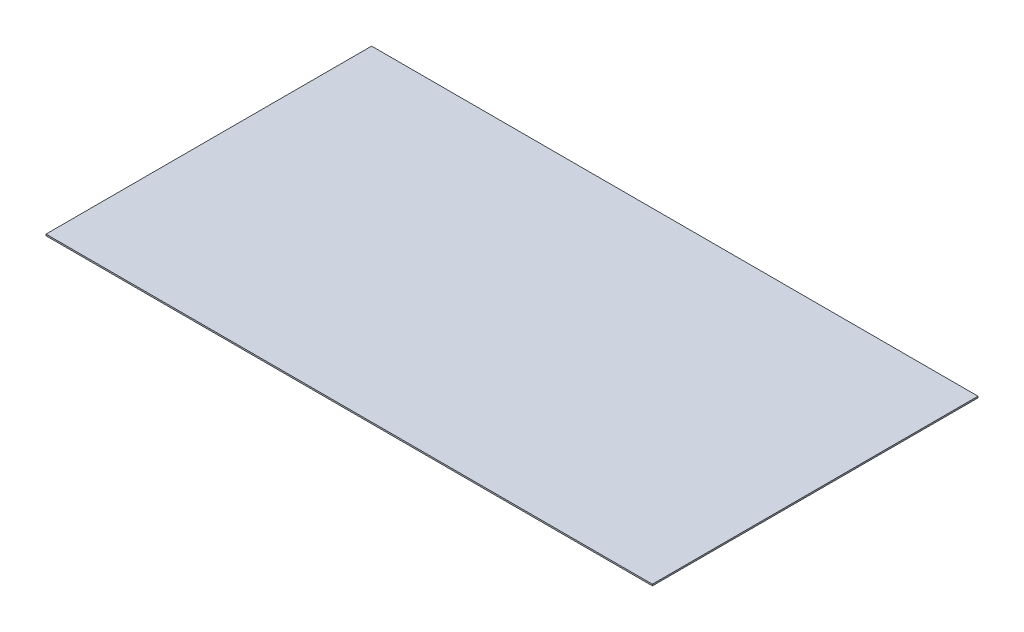
ISO-10303-21;
HEADER;
FILE_DESCRIPTION(('STEP AP214'),'2;1');
FILE_NAME('part.step','',(''),(''),'','','');
FILE_SCHEMA(('AUTOMOTIVE_DESIGN { 1 0 10303 214 1 1 1 1 }'));
ENDSEC;
DATA;
#1=APPLICATION_CONTEXT('core data for automotive mechanical design processes');
#2=APPLICATION_PROTOCOL_DEFINITION('international standard','automotive_design',2000,#1);
#3=PRODUCT_CONTEXT('',#1,'mechanical');
#4=PRODUCT('Part','Part','',(#3));
#5=PRODUCT_RELATED_PRODUCT_CATEGORY('part','',(#4));
#6=PRODUCT_DEFINITION_FORMATION('','',#4);
#7=PRODUCT_DEFINITION_CONTEXT('part definition',#1,'design');
#8=PRODUCT_DEFINITION('design','',#6,#7);
#9=PRODUCT_DEFINITION_SHAPE('','',#8);
#10=(LENGTH_UNIT() NAMED_UNIT(*) SI_UNIT(.MILLI.,.METRE.));
#11=(NAMED_UNIT(*) PLANE_ANGLE_UNIT() SI_UNIT($,.RADIAN.));
#12=(NAMED_UNIT(*) SI_UNIT($,.STERADIAN.) SOLID_ANGLE_UNIT());
#13=UNCERTAINTY_MEASURE_WITH_UNIT(LENGTH_MEASURE(1.E-05),#10,'distance_accuracy_value','');
#14=(GEOMETRIC_REPRESENTATION_CONTEXT(3) GLOBAL_UNCERTAINTY_ASSIGNED_CONTEXT((#13)) GLOBAL_UNIT_ASSIGNED_CONTEXT((#10,
#11,#12)) REPRESENTATION_CONTEXT('',''));
#15=CARTESIAN_POINT('',(0.,0.,0.));
#16=DIRECTION('',(0.,0.,1.));
#17=DIRECTION('',(1.,0.,0.));
#18=AXIS2_PLACEMENT_3D('',#15,#16,#17);
#19=CARTESIAN_POINT('',(-406.,2.,-218.));
#20=DIRECTION('',(1.,0.,0.));
#21=DIRECTION('',(0.,0.,-1.));
#22=AXIS2_PLACEMENT_3D('',#19,#20,#21);
#23=PLANE('',#22);
#24=DIRECTION('',(0.,0.,1.));
#25=VECTOR('',#24,1.);
#26=CARTESIAN_POINT('',(-406.,0.,-218.));
#27=LINE('',#26,#25);
#28=CARTESIAN_POINT('',(-406.,0.,-218.));
#29=VERTEX_POINT('',#28);
#30=CARTESIAN_POINT('',(-406.,0.,218.));
#31=VERTEX_POINT('',#30);
#32=EDGE_CURVE('E97',#29,#31,#27,.T.);
#33=ORIENTED_EDGE('',*,*,#32,.T.);
#34=DIRECTION('',(0.,-1.,0.));
#35=VECTOR('',#34,1.);
#36=CARTESIAN_POINT('',(-406.,2.,218.));
#37=LINE('',#36,#35);
#38=CARTESIAN_POINT('',(-406.,2.,218.));
#39=VERTEX_POINT('',#38);
#40=EDGE_CURVE('E11',#39,#31,#37,.T.);
#41=ORIENTED_EDGE('',*,*,#40,.F.);
#42=DIRECTION('',(0.,0.,1.));
#43=VECTOR('',#42,1.);
#44=CARTESIAN_POINT('',(-406.,2.,-218.));
#45=LINE('',#44,#43);
#46=CARTESIAN_POINT('',(-406.,2.,-218.));
#47=VERTEX_POINT('',#46);
#48=EDGE_CURVE('E85',#47,#39,#45,.T.);
#49=ORIENTED_EDGE('',*,*,#48,.F.);
#50=DIRECTION('',(0.,-1.,0.));
#51=VECTOR('',#50,1.);
#52=CARTESIAN_POINT('',(-406.,2.,-218.));
#53=LINE('',#52,#51);
#54=EDGE_CURVE('E93',#47,#29,#53,.T.);
#55=ORIENTED_EDGE('',*,*,#54,.T.);
#56=EDGE_LOOP('',(#33,#41,#49,#55));
#57=FACE_BOUND('',#56,.T.);
#58=ADVANCED_FACE('F34',(#57),#23,.F.);
#59=CARTESIAN_POINT('',(-406.,2.,218.));
#60=DIRECTION('',(0.,0.,-1.));
#61=DIRECTION('',(-1.,0.,0.));
#62=AXIS2_PLACEMENT_3D('',#59,#60,#61);
#63=PLANE('',#62);
#64=DIRECTION('',(1.,0.,0.));
#65=VECTOR('',#64,1.);
#66=CARTESIAN_POINT('',(-406.,0.,218.));
#67=LINE('',#66,#65);
#68=CARTESIAN_POINT('',(406.,0.,218.));
#69=VERTEX_POINT('',#68);
#70=EDGE_CURVE('E89',#31,#69,#67,.T.);
#71=ORIENTED_EDGE('',*,*,#70,.T.);
#72=DIRECTION('',(0.,-1.,0.));
#73=VECTOR('',#72,1.);
#74=CARTESIAN_POINT('',(406.,2.,218.));
#75=LINE('',#74,#73);
#76=CARTESIAN_POINT('',(406.,2.,218.));
#77=VERTEX_POINT('',#76);
#78=EDGE_CURVE('E42',#77,#69,#75,.T.);
#79=ORIENTED_EDGE('',*,*,#78,.F.);
#80=DIRECTION('',(1.,0.,0.));
#81=VECTOR('',#80,1.);
#82=CARTESIAN_POINT('',(-406.,2.,218.));
#83=LINE('',#82,#81);
#84=EDGE_CURVE('E80',#39,#77,#83,.T.);
#85=ORIENTED_EDGE('',*,*,#84,.F.);
#86=ORIENTED_EDGE('',*,*,#40,.T.);
#87=EDGE_LOOP('',(#71,#79,#85,#86));
#88=FACE_BOUND('',#87,.T.);
#89=ADVANCED_FACE('F88',(#88),#63,.F.);
#90=CARTESIAN_POINT('',(406.,2.,-218.));
#91=DIRECTION('',(-1.,0.,0.));
#92=DIRECTION('',(0.,0.,1.));
#93=AXIS2_PLACEMENT_3D('',#90,#91,#92);
#94=PLANE('',#93);
#95=DIRECTION('',(0.,0.,-1.));
#96=VECTOR('',#95,1.);
#97=CARTESIAN_POINT('',(406.,0.,-218.));
#98=LINE('',#97,#96);
#99=CARTESIAN_POINT('',(406.,0.,-218.));
#100=VERTEX_POINT('',#99);
#101=EDGE_CURVE('E67',#69,#100,#98,.T.);
#102=ORIENTED_EDGE('',*,*,#101,.T.);
#103=DIRECTION('',(0.,-1.,0.));
#104=VECTOR('',#103,1.);
#105=CARTESIAN_POINT('',(406.,2.,-218.));
#106=LINE('',#105,#104);
#107=CARTESIAN_POINT('',(406.,2.,-218.));
#108=VERTEX_POINT('',#107);
#109=EDGE_CURVE('E90',#108,#100,#106,.T.);
#110=ORIENTED_EDGE('',*,*,#109,.F.);
#111=DIRECTION('',(0.,0.,-1.));
#112=VECTOR('',#111,1.);
#113=CARTESIAN_POINT('',(406.,2.,-218.));
#114=LINE('',#113,#112);
#115=EDGE_CURVE('E83',#77,#108,#114,.T.);
#116=ORIENTED_EDGE('',*,*,#115,.F.);
#117=ORIENTED_EDGE('',*,*,#78,.T.);
#118=EDGE_LOOP('',(#102,#110,#116,#117));
#119=FACE_BOUND('',#118,.T.);
#120=ADVANCED_FACE('F91',(#119),#94,.F.);
#121=CARTESIAN_POINT('',(-406.,2.,-218.));
#122=DIRECTION('',(0.,0.,1.));
#123=DIRECTION('',(1.,0.,0.));
#124=AXIS2_PLACEMENT_3D('',#121,#122,#123);
#125=PLANE('',#124);
#126=DIRECTION('',(-1.,0.,0.));
#127=VECTOR('',#126,1.);
#128=CARTESIAN_POINT('',(-406.,0.,-218.));
#129=LINE('',#128,#127);
#130=EDGE_CURVE('E73',#100,#29,#129,.T.);
#131=ORIENTED_EDGE('',*,*,#130,.T.);
#132=ORIENTED_EDGE('',*,*,#54,.F.);
#133=DIRECTION('',(-1.,0.,0.));
#134=VECTOR('',#133,1.);
#135=CARTESIAN_POINT('',(-406.,2.,-218.));
#136=LINE('',#135,#134);
#137=EDGE_CURVE('E50',#108,#47,#136,.T.);
#138=ORIENTED_EDGE('',*,*,#137,.F.);
#139=ORIENTED_EDGE('',*,*,#109,.T.);
#140=EDGE_LOOP('',(#131,#132,#138,#139));
#141=FACE_BOUND('',#140,.T.);
#142=ADVANCED_FACE('F104',(#141),#125,.F.);
#143=CARTESIAN_POINT('',(0.,2.,0.));
#144=DIRECTION('',(0.,1.,0.));
#145=DIRECTION('',(0.,0.,1.));
#146=AXIS2_PLACEMENT_3D('',#143,#144,#145);
#147=PLANE('',#146);
#148=ORIENTED_EDGE('',*,*,#48,.T.);
#149=ORIENTED_EDGE('',*,*,#84,.T.);
#150=ORIENTED_EDGE('',*,*,#115,.T.);
#151=ORIENTED_EDGE('',*,*,#137,.T.);
#152=EDGE_LOOP('',(#148,#149,#150,#151));
#153=FACE_BOUND('',#152,.T.);
#154=ADVANCED_FACE('F81',(#153),#147,.T.);
#155=CARTESIAN_POINT('',(0.,0.,0.));
#156=DIRECTION('',(0.,1.,0.));
#157=DIRECTION('',(0.,0.,1.));
#158=AXIS2_PLACEMENT_3D('',#155,#156,#157);
#159=PLANE('',#158);
#160=ORIENTED_EDGE('',*,*,#32,.F.);
#161=ORIENTED_EDGE('',*,*,#130,.F.);
#162=ORIENTED_EDGE('',*,*,#101,.F.);
#163=ORIENTED_EDGE('',*,*,#70,.F.);
#164=EDGE_LOOP('',(#160,#161,#162,#163));
#165=FACE_BOUND('',#164,.T.);
#166=ADVANCED_FACE('F107',(#165),#159,.F.);
#167=CLOSED_SHELL('',(#58,#89,#120,#142,#154,#166));
#168=MANIFOLD_SOLID_BREP('B2',#167);
#169=ADVANCED_BREP_SHAPE_REPRESENTATION('',(#18,#168),#14);
#170=SHAPE_DEFINITION_REPRESENTATION(#9,#169);
ENDSEC;
END-ISO-10303-21;
